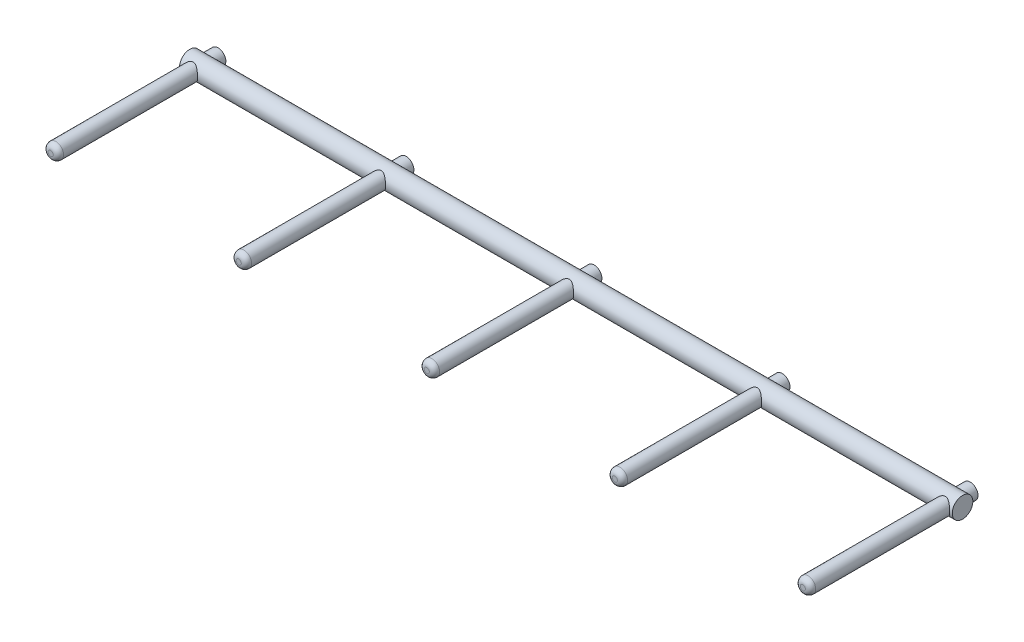
ISO-10303-21;
HEADER;
FILE_DESCRIPTION(('STEP AP214'),'2;1');
FILE_NAME('part.step','',(''),(''),'','','');
FILE_SCHEMA(('AUTOMOTIVE_DESIGN { 1 0 10303 214 1 1 1 1 }'));
ENDSEC;
DATA;
#1=APPLICATION_CONTEXT('core data for automotive mechanical design processes');
#2=APPLICATION_PROTOCOL_DEFINITION('international standard','automotive_design',2000,#1);
#3=PRODUCT_CONTEXT('',#1,'mechanical');
#4=PRODUCT('Part','Part','',(#3));
#5=PRODUCT_RELATED_PRODUCT_CATEGORY('part','',(#4));
#6=PRODUCT_DEFINITION_FORMATION('','',#4);
#7=PRODUCT_DEFINITION_CONTEXT('part definition',#1,'design');
#8=PRODUCT_DEFINITION('design','',#6,#7);
#9=PRODUCT_DEFINITION_SHAPE('','',#8);
#10=(LENGTH_UNIT() NAMED_UNIT(*) SI_UNIT(.MILLI.,.METRE.));
#11=(NAMED_UNIT(*) PLANE_ANGLE_UNIT() SI_UNIT($,.RADIAN.));
#12=(NAMED_UNIT(*) SI_UNIT($,.STERADIAN.) SOLID_ANGLE_UNIT());
#13=UNCERTAINTY_MEASURE_WITH_UNIT(LENGTH_MEASURE(1.E-05),#10,'distance_accuracy_value','');
#14=(GEOMETRIC_REPRESENTATION_CONTEXT(3) GLOBAL_UNCERTAINTY_ASSIGNED_CONTEXT((#13)) GLOBAL_UNIT_ASSIGNED_CONTEXT((#10,
#11,#12)) REPRESENTATION_CONTEXT('',''));
#15=CARTESIAN_POINT('',(0.,0.,0.));
#16=DIRECTION('',(0.,0.,1.));
#17=DIRECTION('',(1.,0.,0.));
#18=AXIS2_PLACEMENT_3D('',#15,#16,#17);
#19=CARTESIAN_POINT('',(-146.,0.,58.));
#20=DIRECTION('',(0.,0.,-1.));
#21=DIRECTION('',(-1.,0.,0.));
#22=AXIS2_PLACEMENT_3D('',#19,#20,#21);
#23=CYLINDRICAL_SURFACE('',#22,3.);
#24=CARTESIAN_POINT('',(-146.,0.,56.));
#25=DIRECTION('',(0.,0.,1.));
#26=DIRECTION('',(1.,0.,0.));
#27=AXIS2_PLACEMENT_3D('',#24,#25,#26);
#28=CIRCLE('',#27,3.);
#29=CARTESIAN_POINT('',(-143.,0.,56.));
#30=VERTEX_POINT('',#29);
#31=EDGE_CURVE('E11',#30,#30,#28,.F.);
#32=ORIENTED_EDGE('',*,*,#31,.T.);
#33=EDGE_LOOP('',(#32));
#34=FACE_BOUND('',#33,.T.);
#35=CARTESIAN_POINT('',(-146.,0.,-7.));
#36=DIRECTION('',(0.,0.,1.));
#37=DIRECTION('',(1.,0.,0.));
#38=AXIS2_PLACEMENT_3D('',#35,#36,#37);
#39=CIRCLE('',#38,3.);
#40=CARTESIAN_POINT('',(-143.,0.,-7.));
#41=VERTEX_POINT('',#40);
#42=EDGE_CURVE('E51',#41,#41,#39,.T.);
#43=ORIENTED_EDGE('',*,*,#42,.T.);
#44=EDGE_LOOP('',(#43));
#45=FACE_BOUND('',#44,.T.);
#46=ADVANCED_FACE('F40',(#34,#45),#23,.T.);
#47=CARTESIAN_POINT('',(-146.,0.,58.));
#48=DIRECTION('',(0.,0.,1.));
#49=DIRECTION('',(1.,0.,0.));
#50=AXIS2_PLACEMENT_3D('',#47,#48,#49);
#51=PLANE('',#50);
#52=CARTESIAN_POINT('',(-146.,0.,58.));
#53=DIRECTION('',(0.,0.,1.));
#54=DIRECTION('',(1.,0.,0.));
#55=AXIS2_PLACEMENT_3D('',#52,#53,#54);
#56=CIRCLE('',#55,1.);
#57=CARTESIAN_POINT('',(-145.,0.,58.));
#58=VERTEX_POINT('',#57);
#59=EDGE_CURVE('E47',#58,#58,#56,.T.);
#60=ORIENTED_EDGE('',*,*,#59,.T.);
#61=EDGE_LOOP('',(#60));
#62=FACE_BOUND('',#61,.T.);
#63=ADVANCED_FACE('F61',(#62),#51,.T.);
#64=CARTESIAN_POINT('',(-146.,0.,-7.));
#65=DIRECTION('',(0.,0.,1.));
#66=DIRECTION('',(1.,0.,0.));
#67=AXIS2_PLACEMENT_3D('',#64,#65,#66);
#68=PLANE('',#67);
#69=ORIENTED_EDGE('',*,*,#42,.F.);
#70=EDGE_LOOP('',(#69));
#71=FACE_BOUND('',#70,.T.);
#72=ADVANCED_FACE('F59',(#71),#68,.F.);
#73=CARTESIAN_POINT('',(-146.,0.,56.));
#74=DIRECTION('',(0.,0.,1.));
#75=DIRECTION('',(1.,0.,0.));
#76=AXIS2_PLACEMENT_3D('',#73,#74,#75);
#77=DEGENERATE_TOROIDAL_SURFACE('',#76,1.,2.,.T.);
#78=ORIENTED_EDGE('',*,*,#31,.F.);
#79=EDGE_LOOP('',(#78));
#80=FACE_BOUND('',#79,.T.);
#81=ORIENTED_EDGE('',*,*,#59,.F.);
#82=EDGE_LOOP('',(#81));
#83=FACE_BOUND('',#82,.T.);
#84=ADVANCED_FACE('F42',(#80,#83),#77,.T.);
#85=CLOSED_SHELL('',(#46,#63,#72,#84));
#86=MANIFOLD_SOLID_BREP('B2',#85);
#87=CARTESIAN_POINT('',(-73.,0.,58.));
#88=DIRECTION('',(0.,0.,-1.));
#89=DIRECTION('',(-1.,0.,0.));
#90=AXIS2_PLACEMENT_3D('',#87,#88,#89);
#91=CYLINDRICAL_SURFACE('',#90,3.);
#92=CARTESIAN_POINT('',(-73.,0.,56.));
#93=DIRECTION('',(0.,0.,1.));
#94=DIRECTION('',(1.,0.,0.));
#95=AXIS2_PLACEMENT_3D('',#92,#93,#94);
#96=CIRCLE('',#95,3.);
#97=CARTESIAN_POINT('',(-70.,0.,56.));
#98=VERTEX_POINT('',#97);
#99=EDGE_CURVE('E39',#98,#98,#96,.F.);
#100=ORIENTED_EDGE('',*,*,#99,.T.);
#101=EDGE_LOOP('',(#100));
#102=FACE_BOUND('',#101,.T.);
#103=CARTESIAN_POINT('',(-73.,0.,-7.));
#104=DIRECTION('',(0.,0.,1.));
#105=DIRECTION('',(1.,0.,0.));
#106=AXIS2_PLACEMENT_3D('',#103,#104,#105);
#107=CIRCLE('',#106,3.);
#108=CARTESIAN_POINT('',(-70.,0.,-7.));
#109=VERTEX_POINT('',#108);
#110=EDGE_CURVE('E115',#109,#109,#107,.T.);
#111=ORIENTED_EDGE('',*,*,#110,.T.);
#112=EDGE_LOOP('',(#111));
#113=FACE_BOUND('',#112,.T.);
#114=ADVANCED_FACE('F104',(#102,#113),#91,.T.);
#115=CARTESIAN_POINT('',(-73.,0.,58.));
#116=DIRECTION('',(0.,0.,1.));
#117=DIRECTION('',(1.,0.,0.));
#118=AXIS2_PLACEMENT_3D('',#115,#116,#117);
#119=PLANE('',#118);
#120=CARTESIAN_POINT('',(-73.,0.,58.));
#121=DIRECTION('',(0.,0.,1.));
#122=DIRECTION('',(1.,0.,0.));
#123=AXIS2_PLACEMENT_3D('',#120,#121,#122);
#124=CIRCLE('',#123,1.);
#125=CARTESIAN_POINT('',(-72.,0.,58.));
#126=VERTEX_POINT('',#125);
#127=EDGE_CURVE('E111',#126,#126,#124,.T.);
#128=ORIENTED_EDGE('',*,*,#127,.T.);
#129=EDGE_LOOP('',(#128));
#130=FACE_BOUND('',#129,.T.);
#131=ADVANCED_FACE('F125',(#130),#119,.T.);
#132=CARTESIAN_POINT('',(-73.,0.,-7.));
#133=DIRECTION('',(0.,0.,1.));
#134=DIRECTION('',(1.,0.,0.));
#135=AXIS2_PLACEMENT_3D('',#132,#133,#134);
#136=PLANE('',#135);
#137=ORIENTED_EDGE('',*,*,#110,.F.);
#138=EDGE_LOOP('',(#137));
#139=FACE_BOUND('',#138,.T.);
#140=ADVANCED_FACE('F123',(#139),#136,.F.);
#141=CARTESIAN_POINT('',(-73.,0.,56.));
#142=DIRECTION('',(0.,0.,1.));
#143=DIRECTION('',(1.,0.,0.));
#144=AXIS2_PLACEMENT_3D('',#141,#142,#143);
#145=DEGENERATE_TOROIDAL_SURFACE('',#144,1.,2.,.T.);
#146=ORIENTED_EDGE('',*,*,#99,.F.);
#147=EDGE_LOOP('',(#146));
#148=FACE_BOUND('',#147,.T.);
#149=ORIENTED_EDGE('',*,*,#127,.F.);
#150=EDGE_LOOP('',(#149));
#151=FACE_BOUND('',#150,.T.);
#152=ADVANCED_FACE('F106',(#148,#151),#145,.T.);
#153=CLOSED_SHELL('',(#114,#131,#140,#152));
#154=MANIFOLD_SOLID_BREP('B6',#153);
#155=CARTESIAN_POINT('',(146.,0.,58.));
#156=DIRECTION('',(0.,0.,-1.));
#157=DIRECTION('',(-1.,0.,0.));
#158=AXIS2_PLACEMENT_3D('',#155,#156,#157);
#159=CYLINDRICAL_SURFACE('',#158,3.);
#160=CARTESIAN_POINT('',(146.,0.,56.));
#161=DIRECTION('',(0.,0.,1.));
#162=DIRECTION('',(1.,0.,0.));
#163=AXIS2_PLACEMENT_3D('',#160,#161,#162);
#164=CIRCLE('',#163,3.);
#165=CARTESIAN_POINT('',(149.,0.,56.));
#166=VERTEX_POINT('',#165);
#167=EDGE_CURVE('E103',#166,#166,#164,.F.);
#168=ORIENTED_EDGE('',*,*,#167,.T.);
#169=EDGE_LOOP('',(#168));
#170=FACE_BOUND('',#169,.T.);
#171=CARTESIAN_POINT('',(146.,0.,-7.));
#172=DIRECTION('',(0.,0.,1.));
#173=DIRECTION('',(1.,0.,0.));
#174=AXIS2_PLACEMENT_3D('',#171,#172,#173);
#175=CIRCLE('',#174,3.);
#176=CARTESIAN_POINT('',(149.,0.,-7.));
#177=VERTEX_POINT('',#176);
#178=EDGE_CURVE('E179',#177,#177,#175,.T.);
#179=ORIENTED_EDGE('',*,*,#178,.T.);
#180=EDGE_LOOP('',(#179));
#181=FACE_BOUND('',#180,.T.);
#182=ADVANCED_FACE('F168',(#170,#181),#159,.T.);
#183=CARTESIAN_POINT('',(146.,0.,58.));
#184=DIRECTION('',(0.,0.,1.));
#185=DIRECTION('',(1.,0.,0.));
#186=AXIS2_PLACEMENT_3D('',#183,#184,#185);
#187=PLANE('',#186);
#188=CARTESIAN_POINT('',(146.,0.,58.));
#189=DIRECTION('',(0.,0.,1.));
#190=DIRECTION('',(1.,0.,0.));
#191=AXIS2_PLACEMENT_3D('',#188,#189,#190);
#192=CIRCLE('',#191,1.);
#193=CARTESIAN_POINT('',(147.,0.,58.));
#194=VERTEX_POINT('',#193);
#195=EDGE_CURVE('E175',#194,#194,#192,.T.);
#196=ORIENTED_EDGE('',*,*,#195,.T.);
#197=EDGE_LOOP('',(#196));
#198=FACE_BOUND('',#197,.T.);
#199=ADVANCED_FACE('F189',(#198),#187,.T.);
#200=CARTESIAN_POINT('',(146.,0.,-7.));
#201=DIRECTION('',(0.,0.,1.));
#202=DIRECTION('',(1.,0.,0.));
#203=AXIS2_PLACEMENT_3D('',#200,#201,#202);
#204=PLANE('',#203);
#205=ORIENTED_EDGE('',*,*,#178,.F.);
#206=EDGE_LOOP('',(#205));
#207=FACE_BOUND('',#206,.T.);
#208=ADVANCED_FACE('F187',(#207),#204,.F.);
#209=CARTESIAN_POINT('',(146.,0.,56.));
#210=DIRECTION('',(0.,0.,1.));
#211=DIRECTION('',(1.,0.,0.));
#212=AXIS2_PLACEMENT_3D('',#209,#210,#211);
#213=DEGENERATE_TOROIDAL_SURFACE('',#212,1.,2.,.T.);
#214=ORIENTED_EDGE('',*,*,#167,.F.);
#215=EDGE_LOOP('',(#214));
#216=FACE_BOUND('',#215,.T.);
#217=ORIENTED_EDGE('',*,*,#195,.F.);
#218=EDGE_LOOP('',(#217));
#219=FACE_BOUND('',#218,.T.);
#220=ADVANCED_FACE('F170',(#216,#219),#213,.T.);
#221=CLOSED_SHELL('',(#182,#199,#208,#220));
#222=MANIFOLD_SOLID_BREP('B34',#221);
#223=CARTESIAN_POINT('',(73.,0.,58.));
#224=DIRECTION('',(0.,0.,-1.));
#225=DIRECTION('',(-1.,0.,0.));
#226=AXIS2_PLACEMENT_3D('',#223,#224,#225);
#227=CYLINDRICAL_SURFACE('',#226,3.);
#228=CARTESIAN_POINT('',(73.,0.,56.));
#229=DIRECTION('',(0.,0.,1.));
#230=DIRECTION('',(1.,0.,0.));
#231=AXIS2_PLACEMENT_3D('',#228,#229,#230);
#232=CIRCLE('',#231,3.);
#233=CARTESIAN_POINT('',(76.,0.,56.));
#234=VERTEX_POINT('',#233);
#235=EDGE_CURVE('E167',#234,#234,#232,.F.);
#236=ORIENTED_EDGE('',*,*,#235,.T.);
#237=EDGE_LOOP('',(#236));
#238=FACE_BOUND('',#237,.T.);
#239=CARTESIAN_POINT('',(73.,0.,-7.));
#240=DIRECTION('',(0.,0.,1.));
#241=DIRECTION('',(1.,0.,0.));
#242=AXIS2_PLACEMENT_3D('',#239,#240,#241);
#243=CIRCLE('',#242,3.);
#244=CARTESIAN_POINT('',(76.,0.,-7.));
#245=VERTEX_POINT('',#244);
#246=EDGE_CURVE('E243',#245,#245,#243,.T.);
#247=ORIENTED_EDGE('',*,*,#246,.T.);
#248=EDGE_LOOP('',(#247));
#249=FACE_BOUND('',#248,.T.);
#250=ADVANCED_FACE('F232',(#238,#249),#227,.T.);
#251=CARTESIAN_POINT('',(73.,0.,58.));
#252=DIRECTION('',(0.,0.,1.));
#253=DIRECTION('',(1.,0.,0.));
#254=AXIS2_PLACEMENT_3D('',#251,#252,#253);
#255=PLANE('',#254);
#256=CARTESIAN_POINT('',(73.,0.,58.));
#257=DIRECTION('',(0.,0.,1.));
#258=DIRECTION('',(1.,0.,0.));
#259=AXIS2_PLACEMENT_3D('',#256,#257,#258);
#260=CIRCLE('',#259,1.);
#261=CARTESIAN_POINT('',(74.,0.,58.));
#262=VERTEX_POINT('',#261);
#263=EDGE_CURVE('E239',#262,#262,#260,.T.);
#264=ORIENTED_EDGE('',*,*,#263,.T.);
#265=EDGE_LOOP('',(#264));
#266=FACE_BOUND('',#265,.T.);
#267=ADVANCED_FACE('F253',(#266),#255,.T.);
#268=CARTESIAN_POINT('',(73.,0.,-7.));
#269=DIRECTION('',(0.,0.,1.));
#270=DIRECTION('',(1.,0.,0.));
#271=AXIS2_PLACEMENT_3D('',#268,#269,#270);
#272=PLANE('',#271);
#273=ORIENTED_EDGE('',*,*,#246,.F.);
#274=EDGE_LOOP('',(#273));
#275=FACE_BOUND('',#274,.T.);
#276=ADVANCED_FACE('F251',(#275),#272,.F.);
#277=CARTESIAN_POINT('',(73.,0.,56.));
#278=DIRECTION('',(0.,0.,1.));
#279=DIRECTION('',(1.,0.,0.));
#280=AXIS2_PLACEMENT_3D('',#277,#278,#279);
#281=DEGENERATE_TOROIDAL_SURFACE('',#280,1.,2.,.T.);
#282=ORIENTED_EDGE('',*,*,#235,.F.);
#283=EDGE_LOOP('',(#282));
#284=FACE_BOUND('',#283,.T.);
#285=ORIENTED_EDGE('',*,*,#263,.F.);
#286=EDGE_LOOP('',(#285));
#287=FACE_BOUND('',#286,.T.);
#288=ADVANCED_FACE('F234',(#284,#287),#281,.T.);
#289=CLOSED_SHELL('',(#250,#267,#276,#288));
#290=MANIFOLD_SOLID_BREP('B98',#289);
#291=CARTESIAN_POINT('',(0.,0.,58.));
#292=DIRECTION('',(0.,0.,-1.));
#293=DIRECTION('',(-1.,0.,0.));
#294=AXIS2_PLACEMENT_3D('',#291,#292,#293);
#295=CYLINDRICAL_SURFACE('',#294,3.);
#296=CARTESIAN_POINT('',(0.,0.,56.));
#297=DIRECTION('',(0.,0.,1.));
#298=DIRECTION('',(1.,0.,0.));
#299=AXIS2_PLACEMENT_3D('',#296,#297,#298);
#300=CIRCLE('',#299,3.);
#301=CARTESIAN_POINT('',(3.,0.,56.));
#302=VERTEX_POINT('',#301);
#303=EDGE_CURVE('E231',#302,#302,#300,.F.);
#304=ORIENTED_EDGE('',*,*,#303,.T.);
#305=EDGE_LOOP('',(#304));
#306=FACE_BOUND('',#305,.T.);
#307=CARTESIAN_POINT('',(0.,0.,-7.));
#308=DIRECTION('',(0.,0.,1.));
#309=DIRECTION('',(1.,0.,0.));
#310=AXIS2_PLACEMENT_3D('',#307,#308,#309);
#311=CIRCLE('',#310,3.);
#312=CARTESIAN_POINT('',(3.,0.,-7.));
#313=VERTEX_POINT('',#312);
#314=EDGE_CURVE('E306',#313,#313,#311,.T.);
#315=ORIENTED_EDGE('',*,*,#314,.T.);
#316=EDGE_LOOP('',(#315));
#317=FACE_BOUND('',#316,.T.);
#318=ADVANCED_FACE('F295',(#306,#317),#295,.T.);
#319=CARTESIAN_POINT('',(0.,0.,58.));
#320=DIRECTION('',(0.,0.,1.));
#321=DIRECTION('',(1.,0.,0.));
#322=AXIS2_PLACEMENT_3D('',#319,#320,#321);
#323=PLANE('',#322);
#324=CARTESIAN_POINT('',(0.,0.,58.));
#325=DIRECTION('',(0.,0.,1.));
#326=DIRECTION('',(1.,0.,0.));
#327=AXIS2_PLACEMENT_3D('',#324,#325,#326);
#328=CIRCLE('',#327,1.);
#329=CARTESIAN_POINT('',(1.,0.,58.));
#330=VERTEX_POINT('',#329);
#331=EDGE_CURVE('E302',#330,#330,#328,.T.);
#332=ORIENTED_EDGE('',*,*,#331,.T.);
#333=EDGE_LOOP('',(#332));
#334=FACE_BOUND('',#333,.T.);
#335=ADVANCED_FACE('F316',(#334),#323,.T.);
#336=CARTESIAN_POINT('',(0.,0.,-7.));
#337=DIRECTION('',(0.,0.,1.));
#338=DIRECTION('',(1.,0.,0.));
#339=AXIS2_PLACEMENT_3D('',#336,#337,#338);
#340=PLANE('',#339);
#341=ORIENTED_EDGE('',*,*,#314,.F.);
#342=EDGE_LOOP('',(#341));
#343=FACE_BOUND('',#342,.T.);
#344=ADVANCED_FACE('F314',(#343),#340,.F.);
#345=CARTESIAN_POINT('',(0.,0.,56.));
#346=DIRECTION('',(0.,0.,1.));
#347=DIRECTION('',(1.,0.,0.));
#348=AXIS2_PLACEMENT_3D('',#345,#346,#347);
#349=DEGENERATE_TOROIDAL_SURFACE('',#348,1.,2.,.T.);
#350=ORIENTED_EDGE('',*,*,#303,.F.);
#351=EDGE_LOOP('',(#350));
#352=FACE_BOUND('',#351,.T.);
#353=ORIENTED_EDGE('',*,*,#331,.F.);
#354=EDGE_LOOP('',(#353));
#355=FACE_BOUND('',#354,.T.);
#356=ADVANCED_FACE('F297',(#352,#355),#349,.T.);
#357=CLOSED_SHELL('',(#318,#335,#344,#356));
#358=MANIFOLD_SOLID_BREP('B162',#357);
#359=CARTESIAN_POINT('',(150.,0.,0.));
#360=DIRECTION('',(-1.,0.,0.));
#361=DIRECTION('',(0.,0.,1.));
#362=AXIS2_PLACEMENT_3D('',#359,#360,#361);
#363=CYLINDRICAL_SURFACE('',#362,4.);
#364=CARTESIAN_POINT('',(150.,0.,0.));
#365=DIRECTION('',(1.,0.,0.));
#366=DIRECTION('',(0.,0.,-1.));
#367=AXIS2_PLACEMENT_3D('',#364,#365,#366);
#368=CIRCLE('',#367,4.);
#369=CARTESIAN_POINT('',(150.,0.,-4.));
#370=VERTEX_POINT('',#369);
#371=EDGE_CURVE('E294',#370,#370,#368,.T.);
#372=ORIENTED_EDGE('',*,*,#371,.F.);
#373=EDGE_LOOP('',(#372));
#374=FACE_BOUND('',#373,.T.);
#375=CARTESIAN_POINT('',(-150.,0.,0.));
#376=DIRECTION('',(1.,0.,0.));
#377=DIRECTION('',(0.,0.,-1.));
#378=AXIS2_PLACEMENT_3D('',#375,#376,#377);
#379=CIRCLE('',#378,4.);
#380=CARTESIAN_POINT('',(-150.,0.,-4.));
#381=VERTEX_POINT('',#380);
#382=EDGE_CURVE('E354',#381,#381,#379,.T.);
#383=ORIENTED_EDGE('',*,*,#382,.T.);
#384=EDGE_LOOP('',(#383));
#385=FACE_BOUND('',#384,.T.);
#386=ADVANCED_FACE('F351',(#374,#385),#363,.T.);
#387=CARTESIAN_POINT('',(150.,0.,0.));
#388=DIRECTION('',(1.,0.,0.));
#389=DIRECTION('',(0.,0.,-1.));
#390=AXIS2_PLACEMENT_3D('',#387,#388,#389);
#391=PLANE('',#390);
#392=ORIENTED_EDGE('',*,*,#371,.T.);
#393=EDGE_LOOP('',(#392));
#394=FACE_BOUND('',#393,.T.);
#395=ADVANCED_FACE('F366',(#394),#391,.T.);
#396=CARTESIAN_POINT('',(-150.,0.,0.));
#397=DIRECTION('',(1.,0.,0.));
#398=DIRECTION('',(0.,0.,-1.));
#399=AXIS2_PLACEMENT_3D('',#396,#397,#398);
#400=PLANE('',#399);
#401=ORIENTED_EDGE('',*,*,#382,.F.);
#402=EDGE_LOOP('',(#401));
#403=FACE_BOUND('',#402,.T.);
#404=ADVANCED_FACE('F364',(#403),#400,.F.);
#405=CLOSED_SHELL('',(#386,#395,#404));
#406=MANIFOLD_SOLID_BREP('B226',#405);
#407=ADVANCED_BREP_SHAPE_REPRESENTATION('',(#18,#86,#154,#222,#290,#358,#406),#14);
#408=SHAPE_DEFINITION_REPRESENTATION(#9,#407);
ENDSEC;
END-ISO-10303-21;
